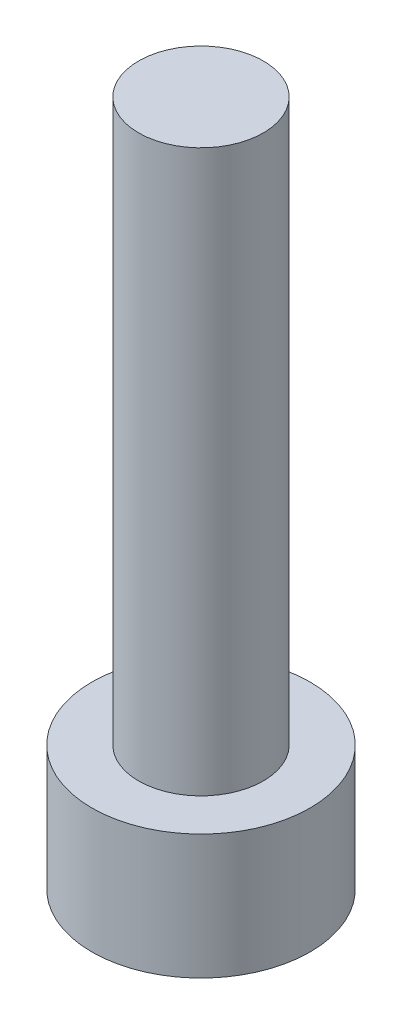
ISO-10303-21;
HEADER;
FILE_DESCRIPTION(('STEP AP214'),'2;1');
FILE_NAME('part.step','',(''),(''),'','','');
FILE_SCHEMA(('AUTOMOTIVE_DESIGN { 1 0 10303 214 1 1 1 1 }'));
ENDSEC;
DATA;
#1=APPLICATION_CONTEXT('core data for automotive mechanical design processes');
#2=APPLICATION_PROTOCOL_DEFINITION('international standard','automotive_design',2000,#1);
#3=PRODUCT_CONTEXT('',#1,'mechanical');
#4=PRODUCT('Part','Part','',(#3));
#5=PRODUCT_RELATED_PRODUCT_CATEGORY('part','',(#4));
#6=PRODUCT_DEFINITION_FORMATION('','',#4);
#7=PRODUCT_DEFINITION_CONTEXT('part definition',#1,'design');
#8=PRODUCT_DEFINITION('design','',#6,#7);
#9=PRODUCT_DEFINITION_SHAPE('','',#8);
#10=(LENGTH_UNIT() NAMED_UNIT(*) SI_UNIT(.MILLI.,.METRE.));
#11=(NAMED_UNIT(*) PLANE_ANGLE_UNIT() SI_UNIT($,.RADIAN.));
#12=(NAMED_UNIT(*) SI_UNIT($,.STERADIAN.) SOLID_ANGLE_UNIT());
#13=UNCERTAINTY_MEASURE_WITH_UNIT(LENGTH_MEASURE(1.E-05),#10,'distance_accuracy_value','');
#14=(GEOMETRIC_REPRESENTATION_CONTEXT(3) GLOBAL_UNCERTAINTY_ASSIGNED_CONTEXT((#13)) GLOBAL_UNIT_ASSIGNED_CONTEXT((#10,
#11,#12)) REPRESENTATION_CONTEXT('',''));
#15=CARTESIAN_POINT('',(0.,0.,0.));
#16=DIRECTION('',(0.,0.,1.));
#17=DIRECTION('',(1.,0.,0.));
#18=AXIS2_PLACEMENT_3D('',#15,#16,#17);
#19=CARTESIAN_POINT('',(0.,4.,0.));
#20=DIRECTION('',(0.,-1.,0.));
#21=DIRECTION('',(0.,0.,-1.));
#22=AXIS2_PLACEMENT_3D('',#19,#20,#21);
#23=CYLINDRICAL_SURFACE('',#22,3.5);
#24=CARTESIAN_POINT('',(0.,4.,0.));
#25=DIRECTION('',(0.,1.,0.));
#26=DIRECTION('',(0.,0.,1.));
#27=AXIS2_PLACEMENT_3D('',#24,#25,#26);
#28=CIRCLE('',#27,3.5);
#29=CARTESIAN_POINT('',(0.,4.,3.5));
#30=VERTEX_POINT('',#29);
#31=EDGE_CURVE('E47',#30,#30,#28,.T.);
#32=ORIENTED_EDGE('',*,*,#31,.F.);
#33=EDGE_LOOP('',(#32));
#34=FACE_BOUND('',#33,.T.);
#35=CARTESIAN_POINT('',(0.,0.,0.));
#36=DIRECTION('',(0.,1.,0.));
#37=DIRECTION('',(0.,0.,1.));
#38=AXIS2_PLACEMENT_3D('',#35,#36,#37);
#39=CIRCLE('',#38,3.5);
#40=CARTESIAN_POINT('',(0.,0.,3.5));
#41=VERTEX_POINT('',#40);
#42=EDGE_CURVE('E42',#41,#41,#39,.T.);
#43=ORIENTED_EDGE('',*,*,#42,.T.);
#44=EDGE_LOOP('',(#43));
#45=FACE_BOUND('',#44,.T.);
#46=ADVANCED_FACE('F41',(#34,#45),#23,.T.);
#47=CARTESIAN_POINT('',(0.,4.,0.));
#48=DIRECTION('',(0.,1.,0.));
#49=DIRECTION('',(0.,0.,1.));
#50=AXIS2_PLACEMENT_3D('',#47,#48,#49);
#51=PLANE('',#50);
#52=CARTESIAN_POINT('',(0.,4.,0.));
#53=DIRECTION('',(0.,1.,0.));
#54=DIRECTION('',(0.,0.,1.));
#55=AXIS2_PLACEMENT_3D('',#52,#53,#54);
#56=CIRCLE('',#55,2.);
#57=CARTESIAN_POINT('',(0.,4.,2.));
#58=VERTEX_POINT('',#57);
#59=EDGE_CURVE('E11',#58,#58,#56,.T.);
#60=ORIENTED_EDGE('',*,*,#59,.F.);
#61=EDGE_LOOP('',(#60));
#62=FACE_BOUND('',#61,.T.);
#63=ORIENTED_EDGE('',*,*,#31,.T.);
#64=EDGE_LOOP('',(#63));
#65=FACE_BOUND('',#64,.T.);
#66=ADVANCED_FACE('F161',(#62,#65),#51,.T.);
#67=CARTESIAN_POINT('',(0.,0.,0.));
#68=DIRECTION('',(0.,1.,0.));
#69=DIRECTION('',(0.,0.,1.));
#70=AXIS2_PLACEMENT_3D('',#67,#68,#69);
#71=PLANE('',#70);
#72=DIRECTION('',(0.221168889485892,0.,0.975235521463189));
#73=VECTOR('',#72,1.);
#74=CARTESIAN_POINT('',(1.27131540537321,0.,-1.17633207048892));
#75=LINE('',#74,#73);
#76=CARTESIAN_POINT('',(1.27131540537321,0.,-1.17633207048892));
#77=VERTEX_POINT('',#76);
#78=CARTESIAN_POINT('',(1.65439115901636,0.,0.512825402031248));
#79=VERTEX_POINT('',#78);
#80=EDGE_CURVE('E133',#77,#79,#75,.T.);
#81=ORIENTED_EDGE('',*,*,#80,.F.);
#82=DIRECTION('',(0.955163181003031,0.,0.296079883910019));
#83=VECTOR('',#82,1.);
#84=CARTESIAN_POINT('',(-0.38307575364315,0.,-1.68915747252017));
#85=LINE('',#84,#83);
#86=CARTESIAN_POINT('',(-0.38307575364315,0.,-1.68915747252017));
#87=VERTEX_POINT('',#86);
#88=EDGE_CURVE('E60',#87,#77,#85,.T.);
#89=ORIENTED_EDGE('',*,*,#88,.F.);
#90=DIRECTION('',(0.733994291517139,0.,-0.67915563755317));
#91=VECTOR('',#90,1.);
#92=CARTESIAN_POINT('',(-1.65439115901636,0.,-0.512825402031248));
#93=LINE('',#92,#91);
#94=CARTESIAN_POINT('',(-1.65439115901636,0.,-0.512825402031248));
#95=VERTEX_POINT('',#94);
#96=EDGE_CURVE('E139',#95,#87,#93,.T.);
#97=ORIENTED_EDGE('',*,*,#96,.F.);
#98=DIRECTION('',(-0.221168889485892,0.,-0.975235521463188));
#99=VECTOR('',#98,1.);
#100=CARTESIAN_POINT('',(-1.27131540537321,0.,1.17633207048892));
#101=LINE('',#100,#99);
#102=CARTESIAN_POINT('',(-1.27131540537321,0.,1.17633207048892));
#103=VERTEX_POINT('',#102);
#104=EDGE_CURVE('E137',#103,#95,#101,.T.);
#105=ORIENTED_EDGE('',*,*,#104,.F.);
#106=DIRECTION('',(-0.955163181003031,0.,-0.296079883910019));
#107=VECTOR('',#106,1.);
#108=CARTESIAN_POINT('',(0.383075753643151,0.,1.68915747252017));
#109=LINE('',#108,#107);
#110=CARTESIAN_POINT('',(0.383075753643151,0.,1.68915747252017));
#111=VERTEX_POINT('',#110);
#112=EDGE_CURVE('E104',#111,#103,#109,.T.);
#113=ORIENTED_EDGE('',*,*,#112,.F.);
#114=DIRECTION('',(-0.733994291517139,0.,0.67915563755317));
#115=VECTOR('',#114,1.);
#116=CARTESIAN_POINT('',(1.65439115901636,0.,0.512825402031248));
#117=LINE('',#116,#115);
#118=EDGE_CURVE('E135',#79,#111,#117,.T.);
#119=ORIENTED_EDGE('',*,*,#118,.F.);
#120=EDGE_LOOP('',(#81,#89,#97,#105,#113,#119));
#121=FACE_BOUND('',#120,.T.);
#122=ORIENTED_EDGE('',*,*,#42,.F.);
#123=EDGE_LOOP('',(#122));
#124=FACE_BOUND('',#123,.T.);
#125=ADVANCED_FACE('F158',(#121,#124),#71,.F.);
#126=CARTESIAN_POINT('',(0.,22.,0.));
#127=DIRECTION('',(0.,-1.,0.));
#128=DIRECTION('',(0.,0.,-1.));
#129=AXIS2_PLACEMENT_3D('',#126,#127,#128);
#130=CYLINDRICAL_SURFACE('',#129,2.);
#131=CARTESIAN_POINT('',(0.,22.,0.));
#132=DIRECTION('',(0.,1.,0.));
#133=DIRECTION('',(0.,0.,1.));
#134=AXIS2_PLACEMENT_3D('',#131,#132,#133);
#135=CIRCLE('',#134,2.);
#136=CARTESIAN_POINT('',(0.,22.,2.));
#137=VERTEX_POINT('',#136);
#138=EDGE_CURVE('E145',#137,#137,#135,.T.);
#139=ORIENTED_EDGE('',*,*,#138,.F.);
#140=EDGE_LOOP('',(#139));
#141=FACE_BOUND('',#140,.T.);
#142=ORIENTED_EDGE('',*,*,#59,.T.);
#143=EDGE_LOOP('',(#142));
#144=FACE_BOUND('',#143,.T.);
#145=ADVANCED_FACE('F159',(#141,#144),#130,.T.);
#146=CARTESIAN_POINT('',(0.,22.,0.));
#147=DIRECTION('',(0.,1.,0.));
#148=DIRECTION('',(0.,0.,1.));
#149=AXIS2_PLACEMENT_3D('',#146,#147,#148);
#150=PLANE('',#149);
#151=ORIENTED_EDGE('',*,*,#138,.T.);
#152=EDGE_LOOP('',(#151));
#153=FACE_BOUND('',#152,.T.);
#154=ADVANCED_FACE('F169',(#153),#150,.T.);
#155=CARTESIAN_POINT('',(-0.38307575364315,1.5,-1.68915747252017));
#156=DIRECTION('',(0.296079883910019,0.,-0.955163181003031));
#157=DIRECTION('',(-0.955163181003031,0.,-0.296079883910019));
#158=AXIS2_PLACEMENT_3D('',#155,#156,#157);
#159=PLANE('',#158);
#160=ORIENTED_EDGE('',*,*,#88,.T.);
#161=DIRECTION('',(0.,-1.,0.));
#162=VECTOR('',#161,1.);
#163=CARTESIAN_POINT('',(1.27131540537321,1.5,-1.17633207048892));
#164=LINE('',#163,#162);
#165=CARTESIAN_POINT('',(1.27131540537321,1.5,-1.17633207048892));
#166=VERTEX_POINT('',#165);
#167=EDGE_CURVE('E87',#166,#77,#164,.T.);
#168=ORIENTED_EDGE('',*,*,#167,.F.);
#169=DIRECTION('',(0.955163181003031,0.,0.296079883910019));
#170=VECTOR('',#169,1.);
#171=CARTESIAN_POINT('',(-0.38307575364315,1.5,-1.68915747252017));
#172=LINE('',#171,#170);
#173=CARTESIAN_POINT('',(-0.38307575364315,1.5,-1.68915747252017));
#174=VERTEX_POINT('',#173);
#175=EDGE_CURVE('E142',#174,#166,#172,.T.);
#176=ORIENTED_EDGE('',*,*,#175,.F.);
#177=DIRECTION('',(0.,-1.,0.));
#178=VECTOR('',#177,1.);
#179=CARTESIAN_POINT('',(-0.38307575364315,1.5,-1.68915747252017));
#180=LINE('',#179,#178);
#181=EDGE_CURVE('E61',#174,#87,#180,.T.);
#182=ORIENTED_EDGE('',*,*,#181,.T.);
#183=EDGE_LOOP('',(#160,#168,#176,#182));
#184=FACE_BOUND('',#183,.T.);
#185=ADVANCED_FACE('F198',(#184),#159,.F.);
#186=CARTESIAN_POINT('',(-1.65439115901636,1.5,-0.512825402031248));
#187=DIRECTION('',(-0.67915563755317,0.,-0.733994291517139));
#188=DIRECTION('',(-0.733994291517139,0.,0.67915563755317));
#189=AXIS2_PLACEMENT_3D('',#186,#187,#188);
#190=PLANE('',#189);
#191=ORIENTED_EDGE('',*,*,#96,.T.);
#192=ORIENTED_EDGE('',*,*,#181,.F.);
#193=DIRECTION('',(0.733994291517139,0.,-0.67915563755317));
#194=VECTOR('',#193,1.);
#195=CARTESIAN_POINT('',(-1.65439115901636,1.5,-0.512825402031248));
#196=LINE('',#195,#194);
#197=CARTESIAN_POINT('',(-1.65439115901636,1.5,-0.512825402031248));
#198=VERTEX_POINT('',#197);
#199=EDGE_CURVE('E119',#198,#174,#196,.T.);
#200=ORIENTED_EDGE('',*,*,#199,.F.);
#201=DIRECTION('',(0.,-1.,0.));
#202=VECTOR('',#201,1.);
#203=CARTESIAN_POINT('',(-1.65439115901636,1.5,-0.512825402031248));
#204=LINE('',#203,#202);
#205=EDGE_CURVE('E108',#198,#95,#204,.T.);
#206=ORIENTED_EDGE('',*,*,#205,.T.);
#207=EDGE_LOOP('',(#191,#192,#200,#206));
#208=FACE_BOUND('',#207,.T.);
#209=ADVANCED_FACE('F208',(#208),#190,.F.);
#210=CARTESIAN_POINT('',(-1.27131540537321,1.5,1.17633207048892));
#211=DIRECTION('',(-0.975235521463189,0.,0.221168889485892));
#212=DIRECTION('',(0.221168889485892,0.,0.975235521463189));
#213=AXIS2_PLACEMENT_3D('',#210,#211,#212);
#214=PLANE('',#213);
#215=ORIENTED_EDGE('',*,*,#104,.T.);
#216=ORIENTED_EDGE('',*,*,#205,.F.);
#217=DIRECTION('',(-0.221168889485892,0.,-0.975235521463188));
#218=VECTOR('',#217,1.);
#219=CARTESIAN_POINT('',(-1.27131540537321,1.5,1.17633207048892));
#220=LINE('',#219,#218);
#221=CARTESIAN_POINT('',(-1.27131540537321,1.5,1.17633207048892));
#222=VERTEX_POINT('',#221);
#223=EDGE_CURVE('E114',#222,#198,#220,.T.);
#224=ORIENTED_EDGE('',*,*,#223,.F.);
#225=DIRECTION('',(0.,-1.,0.));
#226=VECTOR('',#225,1.);
#227=CARTESIAN_POINT('',(-1.27131540537321,1.5,1.17633207048892));
#228=LINE('',#227,#226);
#229=EDGE_CURVE('E98',#222,#103,#228,.T.);
#230=ORIENTED_EDGE('',*,*,#229,.T.);
#231=EDGE_LOOP('',(#215,#216,#224,#230));
#232=FACE_BOUND('',#231,.T.);
#233=ADVANCED_FACE('F111',(#232),#214,.F.);
#234=CARTESIAN_POINT('',(0.383075753643151,1.5,1.68915747252017));
#235=DIRECTION('',(-0.296079883910019,0.,0.955163181003031));
#236=DIRECTION('',(0.955163181003031,0.,0.296079883910019));
#237=AXIS2_PLACEMENT_3D('',#234,#235,#236);
#238=PLANE('',#237);
#239=ORIENTED_EDGE('',*,*,#112,.T.);
#240=ORIENTED_EDGE('',*,*,#229,.F.);
#241=DIRECTION('',(-0.955163181003031,0.,-0.296079883910019));
#242=VECTOR('',#241,1.);
#243=CARTESIAN_POINT('',(0.383075753643151,1.5,1.68915747252017));
#244=LINE('',#243,#242);
#245=CARTESIAN_POINT('',(0.383075753643151,1.5,1.68915747252017));
#246=VERTEX_POINT('',#245);
#247=EDGE_CURVE('E105',#246,#222,#244,.T.);
#248=ORIENTED_EDGE('',*,*,#247,.F.);
#249=DIRECTION('',(0.,-1.,0.));
#250=VECTOR('',#249,1.);
#251=CARTESIAN_POINT('',(0.383075753643151,1.5,1.68915747252017));
#252=LINE('',#251,#250);
#253=EDGE_CURVE('E109',#246,#111,#252,.T.);
#254=ORIENTED_EDGE('',*,*,#253,.T.);
#255=EDGE_LOOP('',(#239,#240,#248,#254));
#256=FACE_BOUND('',#255,.T.);
#257=ADVANCED_FACE('F99',(#256),#238,.F.);
#258=CARTESIAN_POINT('',(1.65439115901636,1.5,0.512825402031248));
#259=DIRECTION('',(0.67915563755317,0.,0.733994291517139));
#260=DIRECTION('',(0.733994291517139,0.,-0.67915563755317));
#261=AXIS2_PLACEMENT_3D('',#258,#259,#260);
#262=PLANE('',#261);
#263=ORIENTED_EDGE('',*,*,#118,.T.);
#264=ORIENTED_EDGE('',*,*,#253,.F.);
#265=DIRECTION('',(-0.733994291517139,0.,0.67915563755317));
#266=VECTOR('',#265,1.);
#267=CARTESIAN_POINT('',(1.65439115901636,1.5,0.512825402031248));
#268=LINE('',#267,#266);
#269=CARTESIAN_POINT('',(1.65439115901636,1.5,0.512825402031248));
#270=VERTEX_POINT('',#269);
#271=EDGE_CURVE('E122',#270,#246,#268,.T.);
#272=ORIENTED_EDGE('',*,*,#271,.F.);
#273=DIRECTION('',(0.,-1.,0.));
#274=VECTOR('',#273,1.);
#275=CARTESIAN_POINT('',(1.65439115901636,1.5,0.512825402031248));
#276=LINE('',#275,#274);
#277=EDGE_CURVE('E150',#270,#79,#276,.T.);
#278=ORIENTED_EDGE('',*,*,#277,.T.);
#279=EDGE_LOOP('',(#263,#264,#272,#278));
#280=FACE_BOUND('',#279,.T.);
#281=ADVANCED_FACE('F232',(#280),#262,.F.);
#282=CARTESIAN_POINT('',(1.27131540537321,1.5,-1.17633207048892));
#283=DIRECTION('',(0.975235521463188,0.,-0.221168889485892));
#284=DIRECTION('',(-0.221168889485892,0.,-0.975235521463189));
#285=AXIS2_PLACEMENT_3D('',#282,#283,#284);
#286=PLANE('',#285);
#287=ORIENTED_EDGE('',*,*,#80,.T.);
#288=ORIENTED_EDGE('',*,*,#277,.F.);
#289=DIRECTION('',(0.221168889485892,0.,0.975235521463189));
#290=VECTOR('',#289,1.);
#291=CARTESIAN_POINT('',(1.27131540537321,1.5,-1.17633207048892));
#292=LINE('',#291,#290);
#293=EDGE_CURVE('E124',#166,#270,#292,.T.);
#294=ORIENTED_EDGE('',*,*,#293,.F.);
#295=ORIENTED_EDGE('',*,*,#167,.T.);
#296=EDGE_LOOP('',(#287,#288,#294,#295));
#297=FACE_BOUND('',#296,.T.);
#298=ADVANCED_FACE('F244',(#297),#286,.F.);
#299=CARTESIAN_POINT('',(0.,1.5,0.));
#300=DIRECTION('',(0.,-1.,0.));
#301=DIRECTION('',(0.,0.,-1.));
#302=AXIS2_PLACEMENT_3D('',#299,#300,#301);
#303=PLANE('',#302);
#304=ORIENTED_EDGE('',*,*,#175,.T.);
#305=ORIENTED_EDGE('',*,*,#293,.T.);
#306=ORIENTED_EDGE('',*,*,#271,.T.);
#307=ORIENTED_EDGE('',*,*,#247,.T.);
#308=ORIENTED_EDGE('',*,*,#223,.T.);
#309=ORIENTED_EDGE('',*,*,#199,.T.);
#310=EDGE_LOOP('',(#304,#305,#306,#307,#308,#309));
#311=FACE_BOUND('',#310,.T.);
#312=ADVANCED_FACE('F116',(#311),#303,.T.);
#313=CLOSED_SHELL('',(#46,#66,#125,#145,#154,#185,#209,#233,#257,#281,#298,#312));
#314=MANIFOLD_SOLID_BREP('B2',#313);
#315=ADVANCED_BREP_SHAPE_REPRESENTATION('',(#18,#314),#14);
#316=SHAPE_DEFINITION_REPRESENTATION(#9,#315);
ENDSEC;
END-ISO-10303-21;
